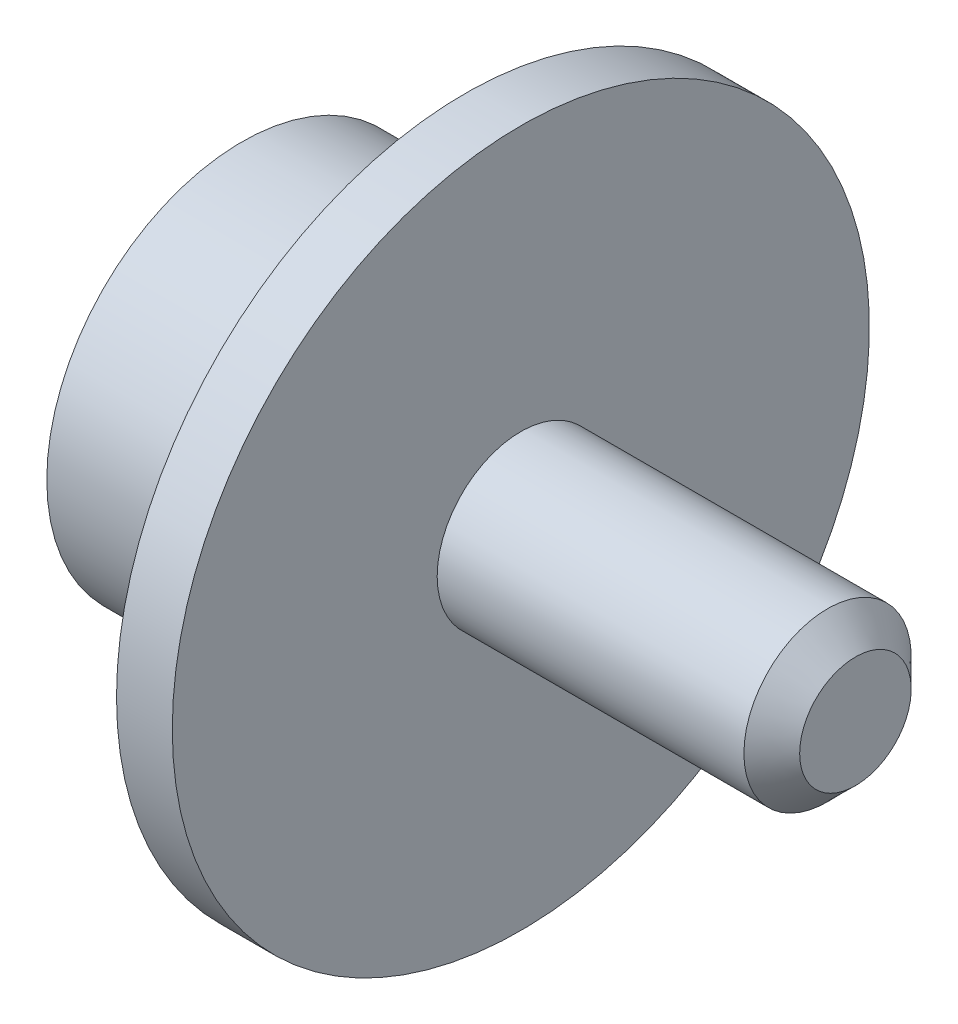
ISO-10303-21;
HEADER;
FILE_DESCRIPTION(('STEP AP214'),'2;1');
FILE_NAME('part.step','',(''),(''),'','','');
FILE_SCHEMA(('AUTOMOTIVE_DESIGN { 1 0 10303 214 1 1 1 1 }'));
ENDSEC;
DATA;
#1=APPLICATION_CONTEXT('core data for automotive mechanical design processes');
#2=APPLICATION_PROTOCOL_DEFINITION('international standard','automotive_design',2000,#1);
#3=PRODUCT_CONTEXT('',#1,'mechanical');
#4=PRODUCT('Part','Part','',(#3));
#5=PRODUCT_RELATED_PRODUCT_CATEGORY('part','',(#4));
#6=PRODUCT_DEFINITION_FORMATION('','',#4);
#7=PRODUCT_DEFINITION_CONTEXT('part definition',#1,'design');
#8=PRODUCT_DEFINITION('design','',#6,#7);
#9=PRODUCT_DEFINITION_SHAPE('','',#8);
#10=(LENGTH_UNIT() NAMED_UNIT(*) SI_UNIT(.MILLI.,.METRE.));
#11=(NAMED_UNIT(*) PLANE_ANGLE_UNIT() SI_UNIT($,.RADIAN.));
#12=(NAMED_UNIT(*) SI_UNIT($,.STERADIAN.) SOLID_ANGLE_UNIT());
#13=UNCERTAINTY_MEASURE_WITH_UNIT(LENGTH_MEASURE(1.E-05),#10,'distance_accuracy_value','');
#14=(GEOMETRIC_REPRESENTATION_CONTEXT(3) GLOBAL_UNCERTAINTY_ASSIGNED_CONTEXT((#13)) GLOBAL_UNIT_ASSIGNED_CONTEXT((#10,
#11,#12)) REPRESENTATION_CONTEXT('',''));
#15=CARTESIAN_POINT('',(0.,0.,0.));
#16=DIRECTION('',(0.,0.,1.));
#17=DIRECTION('',(1.,0.,0.));
#18=AXIS2_PLACEMENT_3D('',#15,#16,#17);
#19=CARTESIAN_POINT('',(7.,0.,0.));
#20=DIRECTION('',(1.,0.,0.));
#21=DIRECTION('',(0.,0.,-1.));
#22=AXIS2_PLACEMENT_3D('',#19,#20,#21);
#23=PLANE('',#22);
#24=CARTESIAN_POINT('',(7.,0.,0.));
#25=DIRECTION('',(-1.,0.,0.));
#26=DIRECTION('',(0.,0.,1.));
#27=AXIS2_PLACEMENT_3D('',#24,#25,#26);
#28=CIRCLE('',#27,5.5);
#29=CARTESIAN_POINT('',(7.,0.,5.5));
#30=VERTEX_POINT('',#29);
#31=EDGE_CURVE('E55',#30,#30,#28,.T.);
#32=ORIENTED_EDGE('',*,*,#31,.T.);
#33=EDGE_LOOP('',(#32));
#34=FACE_BOUND('',#33,.T.);
#35=ADVANCED_FACE('F41',(#34),#23,.F.);
#36=CARTESIAN_POINT('',(0.,0.,0.));
#37=DIRECTION('',(-1.,0.,0.));
#38=DIRECTION('',(0.,0.,1.));
#39=AXIS2_PLACEMENT_3D('',#36,#37,#38);
#40=CYLINDRICAL_SURFACE('',#39,5.5);
#41=ORIENTED_EDGE('',*,*,#31,.F.);
#42=EDGE_LOOP('',(#41));
#43=FACE_BOUND('',#42,.T.);
#44=CARTESIAN_POINT('',(0.,0.,0.));
#45=DIRECTION('',(-1.,0.,0.));
#46=DIRECTION('',(0.,0.,1.));
#47=AXIS2_PLACEMENT_3D('',#44,#45,#46);
#48=CIRCLE('',#47,5.5);
#49=CARTESIAN_POINT('',(0.,0.,5.5));
#50=VERTEX_POINT('',#49);
#51=EDGE_CURVE('E60',#50,#50,#48,.T.);
#52=ORIENTED_EDGE('',*,*,#51,.T.);
#53=EDGE_LOOP('',(#52));
#54=FACE_BOUND('',#53,.T.);
#55=ADVANCED_FACE('F102',(#43,#54),#40,.F.);
#56=CARTESIAN_POINT('',(0.,5.5,0.));
#57=DIRECTION('',(1.,0.,0.));
#58=DIRECTION('',(0.,0.,-1.));
#59=AXIS2_PLACEMENT_3D('',#56,#57,#58);
#60=PLANE('',#59);
#61=ORIENTED_EDGE('',*,*,#51,.F.);
#62=EDGE_LOOP('',(#61));
#63=FACE_BOUND('',#62,.T.);
#64=CARTESIAN_POINT('',(0.,0.,0.));
#65=DIRECTION('',(-1.,0.,0.));
#66=DIRECTION('',(0.,0.,1.));
#67=AXIS2_PLACEMENT_3D('',#64,#65,#66);
#68=CIRCLE('',#67,7.);
#69=CARTESIAN_POINT('',(0.,0.,7.));
#70=VERTEX_POINT('',#69);
#71=EDGE_CURVE('E66',#70,#70,#68,.T.);
#72=ORIENTED_EDGE('',*,*,#71,.T.);
#73=EDGE_LOOP('',(#72));
#74=FACE_BOUND('',#73,.T.);
#75=ADVANCED_FACE('F107',(#63,#74),#60,.F.);
#76=CARTESIAN_POINT('',(0.,0.,0.));
#77=DIRECTION('',(-1.,0.,0.));
#78=DIRECTION('',(0.,0.,1.));
#79=AXIS2_PLACEMENT_3D('',#76,#77,#78);
#80=CYLINDRICAL_SURFACE('',#79,7.);
#81=ORIENTED_EDGE('',*,*,#71,.F.);
#82=EDGE_LOOP('',(#81));
#83=FACE_BOUND('',#82,.T.);
#84=CARTESIAN_POINT('',(8.,0.,0.));
#85=DIRECTION('',(-1.,0.,0.));
#86=DIRECTION('',(0.,0.,1.));
#87=AXIS2_PLACEMENT_3D('',#84,#85,#86);
#88=CIRCLE('',#87,7.);
#89=CARTESIAN_POINT('',(8.,0.,7.));
#90=VERTEX_POINT('',#89);
#91=EDGE_CURVE('E70',#90,#90,#88,.T.);
#92=ORIENTED_EDGE('',*,*,#91,.T.);
#93=EDGE_LOOP('',(#92));
#94=FACE_BOUND('',#93,.T.);
#95=ADVANCED_FACE('F113',(#83,#94),#80,.T.);
#96=CARTESIAN_POINT('',(8.,7.,0.));
#97=DIRECTION('',(1.,0.,0.));
#98=DIRECTION('',(0.,0.,-1.));
#99=AXIS2_PLACEMENT_3D('',#96,#97,#98);
#100=PLANE('',#99);
#101=ORIENTED_EDGE('',*,*,#91,.F.);
#102=EDGE_LOOP('',(#101));
#103=FACE_BOUND('',#102,.T.);
#104=CARTESIAN_POINT('',(8.,0.,0.));
#105=DIRECTION('',(-1.,0.,0.));
#106=DIRECTION('',(0.,0.,1.));
#107=AXIS2_PLACEMENT_3D('',#104,#105,#106);
#108=CIRCLE('',#107,12.5);
#109=CARTESIAN_POINT('',(8.,0.,12.5));
#110=VERTEX_POINT('',#109);
#111=EDGE_CURVE('E74',#110,#110,#108,.T.);
#112=ORIENTED_EDGE('',*,*,#111,.T.);
#113=EDGE_LOOP('',(#112));
#114=FACE_BOUND('',#113,.T.);
#115=ADVANCED_FACE('F117',(#103,#114),#100,.F.);
#116=CARTESIAN_POINT('',(0.,0.,0.));
#117=DIRECTION('',(-1.,0.,0.));
#118=DIRECTION('',(0.,0.,1.));
#119=AXIS2_PLACEMENT_3D('',#116,#117,#118);
#120=CYLINDRICAL_SURFACE('',#119,12.5);
#121=ORIENTED_EDGE('',*,*,#111,.F.);
#122=EDGE_LOOP('',(#121));
#123=FACE_BOUND('',#122,.T.);
#124=CARTESIAN_POINT('',(10.,0.,0.));
#125=DIRECTION('',(-1.,0.,0.));
#126=DIRECTION('',(0.,0.,1.));
#127=AXIS2_PLACEMENT_3D('',#124,#125,#126);
#128=CIRCLE('',#127,12.5);
#129=CARTESIAN_POINT('',(10.,0.,12.5));
#130=VERTEX_POINT('',#129);
#131=EDGE_CURVE('E78',#130,#130,#128,.T.);
#132=ORIENTED_EDGE('',*,*,#131,.T.);
#133=EDGE_LOOP('',(#132));
#134=FACE_BOUND('',#133,.T.);
#135=ADVANCED_FACE('F98',(#123,#134),#120,.T.);
#136=CARTESIAN_POINT('',(10.,12.5,0.));
#137=DIRECTION('',(-1.,0.,0.));
#138=DIRECTION('',(0.,0.,1.));
#139=AXIS2_PLACEMENT_3D('',#136,#137,#138);
#140=PLANE('',#139);
#141=ORIENTED_EDGE('',*,*,#131,.F.);
#142=EDGE_LOOP('',(#141));
#143=FACE_BOUND('',#142,.T.);
#144=CARTESIAN_POINT('',(10.,0.,0.));
#145=DIRECTION('',(-1.,0.,0.));
#146=DIRECTION('',(0.,0.,1.));
#147=AXIS2_PLACEMENT_3D('',#144,#145,#146);
#148=CIRCLE('',#147,3.);
#149=CARTESIAN_POINT('',(10.,0.,3.));
#150=VERTEX_POINT('',#149);
#151=EDGE_CURVE('E82',#150,#150,#148,.T.);
#152=ORIENTED_EDGE('',*,*,#151,.T.);
#153=EDGE_LOOP('',(#152));
#154=FACE_BOUND('',#153,.T.);
#155=ADVANCED_FACE('F87',(#143,#154),#140,.F.);
#156=CARTESIAN_POINT('',(0.,0.,0.));
#157=DIRECTION('',(-1.,0.,0.));
#158=DIRECTION('',(0.,0.,1.));
#159=AXIS2_PLACEMENT_3D('',#156,#157,#158);
#160=CYLINDRICAL_SURFACE('',#159,3.);
#161=CARTESIAN_POINT('',(21.,0.,0.));
#162=DIRECTION('',(-1.,0.,0.));
#163=DIRECTION('',(0.,0.,1.));
#164=AXIS2_PLACEMENT_3D('',#161,#162,#163);
#165=CIRCLE('',#164,3.);
#166=CARTESIAN_POINT('',(21.,0.,3.));
#167=VERTEX_POINT('',#166);
#168=EDGE_CURVE('E50',#167,#167,#165,.T.);
#169=ORIENTED_EDGE('',*,*,#168,.T.);
#170=EDGE_LOOP('',(#169));
#171=FACE_BOUND('',#170,.T.);
#172=ORIENTED_EDGE('',*,*,#151,.F.);
#173=EDGE_LOOP('',(#172));
#174=FACE_BOUND('',#173,.T.);
#175=ADVANCED_FACE('F89',(#171,#174),#160,.T.);
#176=CARTESIAN_POINT('',(22.,3.,0.));
#177=DIRECTION('',(-1.,0.,0.));
#178=DIRECTION('',(0.,0.,1.));
#179=AXIS2_PLACEMENT_3D('',#176,#177,#178);
#180=PLANE('',#179);
#181=CARTESIAN_POINT('',(22.,0.,0.));
#182=DIRECTION('',(-1.,0.,0.));
#183=DIRECTION('',(0.,0.,1.));
#184=AXIS2_PLACEMENT_3D('',#181,#182,#183);
#185=CIRCLE('',#184,1.99999999999999);
#186=CARTESIAN_POINT('',(22.,0.,1.99999999999999));
#187=VERTEX_POINT('',#186);
#188=EDGE_CURVE('E10',#187,#187,#185,.F.);
#189=ORIENTED_EDGE('',*,*,#188,.T.);
#190=EDGE_LOOP('',(#189));
#191=FACE_BOUND('',#190,.T.);
#192=ADVANCED_FACE('F91',(#191),#180,.F.);
#193=CARTESIAN_POINT('',(21.,0.,0.));
#194=DIRECTION('',(-1.,0.,0.));
#195=DIRECTION('',(0.,0.,1.));
#196=AXIS2_PLACEMENT_3D('',#193,#194,#195);
#197=CONICAL_SURFACE('',#196,3.,0.78539816339745);
#198=ORIENTED_EDGE('',*,*,#188,.F.);
#199=EDGE_LOOP('',(#198));
#200=FACE_BOUND('',#199,.T.);
#201=ORIENTED_EDGE('',*,*,#168,.F.);
#202=EDGE_LOOP('',(#201));
#203=FACE_BOUND('',#202,.T.);
#204=ADVANCED_FACE('F44',(#200,#203),#197,.T.);
#205=CLOSED_SHELL('',(#35,#55,#75,#95,#115,#135,#155,#175,#192,#204));
#206=MANIFOLD_SOLID_BREP('B2',#205);
#207=ADVANCED_BREP_SHAPE_REPRESENTATION('',(#18,#206),#14);
#208=SHAPE_DEFINITION_REPRESENTATION(#9,#207);
ENDSEC;
END-ISO-10303-21;
